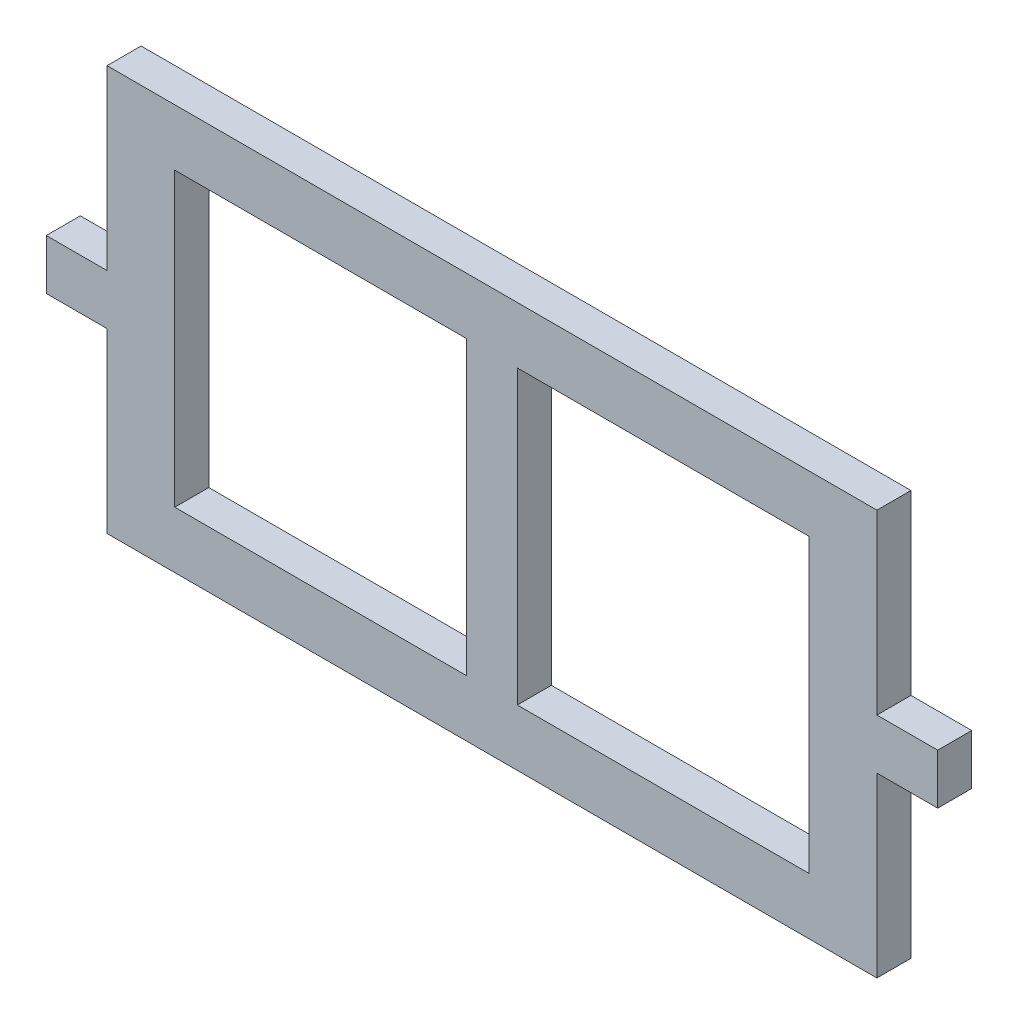
ISO-10303-21;
HEADER;
FILE_DESCRIPTION(('STEP AP214'),'2;1');
FILE_NAME('part.step','',(''),(''),'','','');
FILE_SCHEMA(('AUTOMOTIVE_DESIGN { 1 0 10303 214 1 1 1 1 }'));
ENDSEC;
DATA;
#1=APPLICATION_CONTEXT('core data for automotive mechanical design processes');
#2=APPLICATION_PROTOCOL_DEFINITION('international standard','automotive_design',2000,#1);
#3=PRODUCT_CONTEXT('',#1,'mechanical');
#4=PRODUCT('Part','Part','',(#3));
#5=PRODUCT_RELATED_PRODUCT_CATEGORY('part','',(#4));
#6=PRODUCT_DEFINITION_FORMATION('','',#4);
#7=PRODUCT_DEFINITION_CONTEXT('part definition',#1,'design');
#8=PRODUCT_DEFINITION('design','',#6,#7);
#9=PRODUCT_DEFINITION_SHAPE('','',#8);
#10=(LENGTH_UNIT() NAMED_UNIT(*) SI_UNIT(.MILLI.,.METRE.));
#11=(NAMED_UNIT(*) PLANE_ANGLE_UNIT() SI_UNIT($,.RADIAN.));
#12=(NAMED_UNIT(*) SI_UNIT($,.STERADIAN.) SOLID_ANGLE_UNIT());
#13=UNCERTAINTY_MEASURE_WITH_UNIT(LENGTH_MEASURE(1.E-05),#10,'distance_accuracy_value','');
#14=(GEOMETRIC_REPRESENTATION_CONTEXT(3) GLOBAL_UNCERTAINTY_ASSIGNED_CONTEXT((#13)) GLOBAL_UNIT_ASSIGNED_CONTEXT((#10,
#11,#12)) REPRESENTATION_CONTEXT('',''));
#15=CARTESIAN_POINT('',(0.,0.,0.));
#16=DIRECTION('',(0.,0.,1.));
#17=DIRECTION('',(1.,0.,0.));
#18=AXIS2_PLACEMENT_3D('',#15,#16,#17);
#19=CARTESIAN_POINT('',(120.65,-63.5,10.668));
#20=DIRECTION('',(-1.,0.,0.));
#21=DIRECTION('',(0.,0.,1.));
#22=AXIS2_PLACEMENT_3D('',#19,#20,#21);
#23=PLANE('',#22);
#24=DIRECTION('',(0.,0.,1.));
#25=VECTOR('',#24,1.);
#26=CARTESIAN_POINT('',(120.65,7.87399999999999,0.));
#27=LINE('',#26,#25);
#28=CARTESIAN_POINT('',(120.65,7.87399999999999,0.));
#29=VERTEX_POINT('',#28);
#30=CARTESIAN_POINT('',(120.65,7.87399999999999,10.668));
#31=VERTEX_POINT('',#30);
#32=EDGE_CURVE('E247',#29,#31,#27,.T.);
#33=ORIENTED_EDGE('',*,*,#32,.F.);
#34=DIRECTION('',(0.,1.,0.));
#35=VECTOR('',#34,1.);
#36=CARTESIAN_POINT('',(120.65,-63.5,0.));
#37=LINE('',#36,#35);
#38=CARTESIAN_POINT('',(120.65,63.5,0.));
#39=VERTEX_POINT('',#38);
#40=EDGE_CURVE('E198',#29,#39,#37,.T.);
#41=ORIENTED_EDGE('',*,*,#40,.T.);
#42=DIRECTION('',(0.,0.,-1.));
#43=VECTOR('',#42,1.);
#44=CARTESIAN_POINT('',(120.65,63.5,10.668));
#45=LINE('',#44,#43);
#46=CARTESIAN_POINT('',(120.65,63.5,10.668));
#47=VERTEX_POINT('',#46);
#48=EDGE_CURVE('E11',#47,#39,#45,.T.);
#49=ORIENTED_EDGE('',*,*,#48,.F.);
#50=DIRECTION('',(0.,1.,0.));
#51=VECTOR('',#50,1.);
#52=CARTESIAN_POINT('',(120.65,-63.5,10.668));
#53=LINE('',#52,#51);
#54=EDGE_CURVE('E212',#31,#47,#53,.T.);
#55=ORIENTED_EDGE('',*,*,#54,.F.);
#56=EDGE_LOOP('',(#33,#41,#49,#55));
#57=FACE_BOUND('',#56,.T.);
#58=ADVANCED_FACE('F36',(#57),#23,.F.);
#59=CARTESIAN_POINT('',(-120.65,-63.5,10.668));
#60=DIRECTION('',(1.,0.,0.));
#61=DIRECTION('',(0.,0.,-1.));
#62=AXIS2_PLACEMENT_3D('',#59,#60,#61);
#63=PLANE('',#62);
#64=DIRECTION('',(0.,0.,1.));
#65=VECTOR('',#64,1.);
#66=CARTESIAN_POINT('',(-120.65,-7.87400000000002,0.));
#67=LINE('',#66,#65);
#68=CARTESIAN_POINT('',(-120.65,-7.87400000000002,0.));
#69=VERTEX_POINT('',#68);
#70=CARTESIAN_POINT('',(-120.65,-7.87400000000002,10.668));
#71=VERTEX_POINT('',#70);
#72=EDGE_CURVE('E250',#69,#71,#67,.T.);
#73=ORIENTED_EDGE('',*,*,#72,.F.);
#74=DIRECTION('',(0.,-1.,0.));
#75=VECTOR('',#74,1.);
#76=CARTESIAN_POINT('',(-120.65,-63.5,0.));
#77=LINE('',#76,#75);
#78=CARTESIAN_POINT('',(-120.65,-63.5,0.));
#79=VERTEX_POINT('',#78);
#80=EDGE_CURVE('E200',#69,#79,#77,.T.);
#81=ORIENTED_EDGE('',*,*,#80,.T.);
#82=DIRECTION('',(0.,0.,-1.));
#83=VECTOR('',#82,1.);
#84=CARTESIAN_POINT('',(-120.65,-63.5,10.668));
#85=LINE('',#84,#83);
#86=CARTESIAN_POINT('',(-120.65,-63.5,10.668));
#87=VERTEX_POINT('',#86);
#88=EDGE_CURVE('E214',#87,#79,#85,.T.);
#89=ORIENTED_EDGE('',*,*,#88,.F.);
#90=DIRECTION('',(0.,-1.,0.));
#91=VECTOR('',#90,1.);
#92=CARTESIAN_POINT('',(-120.65,-63.5,10.668));
#93=LINE('',#92,#91);
#94=EDGE_CURVE('E321',#71,#87,#93,.T.);
#95=ORIENTED_EDGE('',*,*,#94,.F.);
#96=EDGE_LOOP('',(#73,#81,#89,#95));
#97=FACE_BOUND('',#96,.T.);
#98=ADVANCED_FACE('F331',(#97),#63,.F.);
#99=CARTESIAN_POINT('',(0.,0.,10.668));
#100=DIRECTION('',(0.,0.,-1.));
#101=DIRECTION('',(-1.,0.,0.));
#102=AXIS2_PLACEMENT_3D('',#99,#100,#101);
#103=PLANE('',#102);
#104=DIRECTION('',(0.,-1.,0.));
#105=VECTOR('',#104,1.);
#106=CARTESIAN_POINT('',(99.4375,0.,10.668));
#107=LINE('',#106,#105);
#108=CARTESIAN_POINT('',(99.4375,45.75,10.668));
#109=VERTEX_POINT('',#108);
#110=CARTESIAN_POINT('',(99.4375,-45.75,10.668));
#111=VERTEX_POINT('',#110);
#112=EDGE_CURVE('E252',#109,#111,#107,.T.);
#113=ORIENTED_EDGE('',*,*,#112,.T.);
#114=DIRECTION('',(1.,0.,0.));
#115=VECTOR('',#114,1.);
#116=CARTESIAN_POINT('',(0.,-45.75,10.668));
#117=LINE('',#116,#115);
#118=CARTESIAN_POINT('',(7.93750000000001,-45.75,10.668));
#119=VERTEX_POINT('',#118);
#120=EDGE_CURVE('E292',#119,#111,#117,.T.);
#121=ORIENTED_EDGE('',*,*,#120,.F.);
#122=DIRECTION('',(0.,-1.,0.));
#123=VECTOR('',#122,1.);
#124=CARTESIAN_POINT('',(7.93750000000001,0.,10.668));
#125=LINE('',#124,#123);
#126=CARTESIAN_POINT('',(7.9375,45.75,10.668));
#127=VERTEX_POINT('',#126);
#128=EDGE_CURVE('E306',#127,#119,#125,.T.);
#129=ORIENTED_EDGE('',*,*,#128,.F.);
#130=DIRECTION('',(1.,0.,0.));
#131=VECTOR('',#130,1.);
#132=CARTESIAN_POINT('',(0.,45.75,10.668));
#133=LINE('',#132,#131);
#134=EDGE_CURVE('E303',#127,#109,#133,.T.);
#135=ORIENTED_EDGE('',*,*,#134,.T.);
#136=EDGE_LOOP('',(#113,#121,#129,#135));
#137=FACE_BOUND('',#136,.T.);
#138=CARTESIAN_POINT('',(120.65,-63.5,10.668));
#139=VERTEX_POINT('',#138);
#140=CARTESIAN_POINT('',(120.65,-7.87400000000002,10.668));
#141=VERTEX_POINT('',#140);
#142=EDGE_CURVE('E318',#139,#141,#53,.T.);
#143=ORIENTED_EDGE('',*,*,#142,.T.);
#144=DIRECTION('',(-1.,0.,0.));
#145=VECTOR('',#144,1.);
#146=CARTESIAN_POINT('',(139.7,-7.87400000000001,10.668));
#147=LINE('',#146,#145);
#148=CARTESIAN_POINT('',(139.7,-7.87400000000001,10.668));
#149=VERTEX_POINT('',#148);
#150=EDGE_CURVE('E51',#149,#141,#147,.T.);
#151=ORIENTED_EDGE('',*,*,#150,.F.);
#152=DIRECTION('',(0.,-1.,0.));
#153=VECTOR('',#152,1.);
#154=CARTESIAN_POINT('',(139.7,7.87399999999999,10.668));
#155=LINE('',#154,#153);
#156=CARTESIAN_POINT('',(139.7,7.87399999999999,10.668));
#157=VERTEX_POINT('',#156);
#158=EDGE_CURVE('E336',#157,#149,#155,.T.);
#159=ORIENTED_EDGE('',*,*,#158,.F.);
#160=DIRECTION('',(1.,0.,0.));
#161=VECTOR('',#160,1.);
#162=CARTESIAN_POINT('',(120.65,7.87399999999999,10.668));
#163=LINE('',#162,#161);
#164=EDGE_CURVE('E184',#31,#157,#163,.T.);
#165=ORIENTED_EDGE('',*,*,#164,.F.);
#166=ORIENTED_EDGE('',*,*,#54,.T.);
#167=DIRECTION('',(-1.,0.,0.));
#168=VECTOR('',#167,1.);
#169=CARTESIAN_POINT('',(-120.65,63.5,10.668));
#170=LINE('',#169,#168);
#171=CARTESIAN_POINT('',(-120.65,63.5,10.668));
#172=VERTEX_POINT('',#171);
#173=EDGE_CURVE('E320',#47,#172,#170,.T.);
#174=ORIENTED_EDGE('',*,*,#173,.T.);
#175=CARTESIAN_POINT('',(-120.65,7.87399999999999,10.668));
#176=VERTEX_POINT('',#175);
#177=EDGE_CURVE('E223',#172,#176,#93,.T.);
#178=ORIENTED_EDGE('',*,*,#177,.T.);
#179=DIRECTION('',(-1.,0.,0.));
#180=VECTOR('',#179,1.);
#181=CARTESIAN_POINT('',(-120.65,7.87399999999999,10.668));
#182=LINE('',#181,#180);
#183=CARTESIAN_POINT('',(-139.7,7.87399999999999,10.668));
#184=VERTEX_POINT('',#183);
#185=EDGE_CURVE('E59',#176,#184,#182,.T.);
#186=ORIENTED_EDGE('',*,*,#185,.T.);
#187=DIRECTION('',(0.,-1.,0.));
#188=VECTOR('',#187,1.);
#189=CARTESIAN_POINT('',(-139.7,7.87399999999999,10.668));
#190=LINE('',#189,#188);
#191=CARTESIAN_POINT('',(-139.7,-7.87400000000001,10.668));
#192=VERTEX_POINT('',#191);
#193=EDGE_CURVE('E240',#184,#192,#190,.T.);
#194=ORIENTED_EDGE('',*,*,#193,.T.);
#195=DIRECTION('',(1.,0.,0.));
#196=VECTOR('',#195,1.);
#197=CARTESIAN_POINT('',(-139.7,-7.87400000000001,10.668));
#198=LINE('',#197,#196);
#199=EDGE_CURVE('E235',#192,#71,#198,.T.);
#200=ORIENTED_EDGE('',*,*,#199,.T.);
#201=ORIENTED_EDGE('',*,*,#94,.T.);
#202=DIRECTION('',(1.,0.,0.));
#203=VECTOR('',#202,1.);
#204=CARTESIAN_POINT('',(-120.65,-63.5,10.668));
#205=LINE('',#204,#203);
#206=EDGE_CURVE('E204',#87,#139,#205,.T.);
#207=ORIENTED_EDGE('',*,*,#206,.T.);
#208=EDGE_LOOP('',(#143,#151,#159,#165,#166,#174,#178,#186,#194,#200,#201,#207));
#209=FACE_BOUND('',#208,.T.);
#210=DIRECTION('',(0.,-1.,0.));
#211=VECTOR('',#210,1.);
#212=CARTESIAN_POINT('',(-7.93750000000001,0.,10.668));
#213=LINE('',#212,#211);
#214=CARTESIAN_POINT('',(-7.9375,45.75,10.668));
#215=VERTEX_POINT('',#214);
#216=CARTESIAN_POINT('',(-7.93750000000001,-45.75,10.668));
#217=VERTEX_POINT('',#216);
#218=EDGE_CURVE('E270',#215,#217,#213,.T.);
#219=ORIENTED_EDGE('',*,*,#218,.T.);
#220=DIRECTION('',(1.,0.,0.));
#221=VECTOR('',#220,1.);
#222=CARTESIAN_POINT('',(0.,-45.75,10.668));
#223=LINE('',#222,#221);
#224=CARTESIAN_POINT('',(-99.4375,-45.75,10.668));
#225=VERTEX_POINT('',#224);
#226=EDGE_CURVE('E261',#225,#217,#223,.T.);
#227=ORIENTED_EDGE('',*,*,#226,.F.);
#228=DIRECTION('',(0.,-1.,0.));
#229=VECTOR('',#228,1.);
#230=CARTESIAN_POINT('',(-99.4375,0.,10.668));
#231=LINE('',#230,#229);
#232=CARTESIAN_POINT('',(-99.4375,45.75,10.668));
#233=VERTEX_POINT('',#232);
#234=EDGE_CURVE('E277',#233,#225,#231,.T.);
#235=ORIENTED_EDGE('',*,*,#234,.F.);
#236=DIRECTION('',(1.,0.,0.));
#237=VECTOR('',#236,1.);
#238=CARTESIAN_POINT('',(0.,45.75,10.668));
#239=LINE('',#238,#237);
#240=EDGE_CURVE('E273',#233,#215,#239,.T.);
#241=ORIENTED_EDGE('',*,*,#240,.T.);
#242=EDGE_LOOP('',(#219,#227,#235,#241));
#243=FACE_BOUND('',#242,.T.);
#244=ADVANCED_FACE('F325',(#137,#209,#243),#103,.F.);
#245=CARTESIAN_POINT('',(0.,0.,0.));
#246=DIRECTION('',(0.,0.,-1.));
#247=DIRECTION('',(-1.,0.,0.));
#248=AXIS2_PLACEMENT_3D('',#245,#246,#247);
#249=PLANE('',#248);
#250=CARTESIAN_POINT('',(120.65,-63.5,0.));
#251=VERTEX_POINT('',#250);
#252=CARTESIAN_POINT('',(120.65,-7.87400000000002,0.));
#253=VERTEX_POINT('',#252);
#254=EDGE_CURVE('E180',#251,#253,#37,.T.);
#255=ORIENTED_EDGE('',*,*,#254,.F.);
#256=DIRECTION('',(1.,0.,0.));
#257=VECTOR('',#256,1.);
#258=CARTESIAN_POINT('',(-120.65,-63.5,0.));
#259=LINE('',#258,#257);
#260=EDGE_CURVE('E210',#79,#251,#259,.T.);
#261=ORIENTED_EDGE('',*,*,#260,.F.);
#262=ORIENTED_EDGE('',*,*,#80,.F.);
#263=DIRECTION('',(1.,0.,0.));
#264=VECTOR('',#263,1.);
#265=CARTESIAN_POINT('',(-139.7,-7.87400000000001,0.));
#266=LINE('',#265,#264);
#267=CARTESIAN_POINT('',(-139.7,-7.87400000000001,0.));
#268=VERTEX_POINT('',#267);
#269=EDGE_CURVE('E237',#268,#69,#266,.T.);
#270=ORIENTED_EDGE('',*,*,#269,.F.);
#271=DIRECTION('',(0.,-1.,0.));
#272=VECTOR('',#271,1.);
#273=CARTESIAN_POINT('',(-139.7,7.87399999999999,0.));
#274=LINE('',#273,#272);
#275=CARTESIAN_POINT('',(-139.7,7.87399999999999,0.));
#276=VERTEX_POINT('',#275);
#277=EDGE_CURVE('E234',#276,#268,#274,.T.);
#278=ORIENTED_EDGE('',*,*,#277,.F.);
#279=DIRECTION('',(-1.,0.,0.));
#280=VECTOR('',#279,1.);
#281=CARTESIAN_POINT('',(-120.65,7.87399999999999,0.));
#282=LINE('',#281,#280);
#283=CARTESIAN_POINT('',(-120.65,7.87399999999999,0.));
#284=VERTEX_POINT('',#283);
#285=EDGE_CURVE('E231',#284,#276,#282,.T.);
#286=ORIENTED_EDGE('',*,*,#285,.F.);
#287=CARTESIAN_POINT('',(-120.65,63.5,0.));
#288=VERTEX_POINT('',#287);
#289=EDGE_CURVE('E207',#288,#284,#77,.T.);
#290=ORIENTED_EDGE('',*,*,#289,.F.);
#291=DIRECTION('',(-1.,0.,0.));
#292=VECTOR('',#291,1.);
#293=CARTESIAN_POINT('',(-120.65,63.5,0.));
#294=LINE('',#293,#292);
#295=EDGE_CURVE('E197',#39,#288,#294,.T.);
#296=ORIENTED_EDGE('',*,*,#295,.F.);
#297=ORIENTED_EDGE('',*,*,#40,.F.);
#298=DIRECTION('',(1.,0.,0.));
#299=VECTOR('',#298,1.);
#300=CARTESIAN_POINT('',(120.65,7.87399999999999,0.));
#301=LINE('',#300,#299);
#302=CARTESIAN_POINT('',(139.7,7.87399999999999,0.));
#303=VERTEX_POINT('',#302);
#304=EDGE_CURVE('E192',#29,#303,#301,.T.);
#305=ORIENTED_EDGE('',*,*,#304,.T.);
#306=DIRECTION('',(0.,-1.,0.));
#307=VECTOR('',#306,1.);
#308=CARTESIAN_POINT('',(139.7,7.87399999999999,0.));
#309=LINE('',#308,#307);
#310=CARTESIAN_POINT('',(139.7,-7.87400000000001,0.));
#311=VERTEX_POINT('',#310);
#312=EDGE_CURVE('E182',#303,#311,#309,.T.);
#313=ORIENTED_EDGE('',*,*,#312,.T.);
#314=DIRECTION('',(-1.,0.,0.));
#315=VECTOR('',#314,1.);
#316=CARTESIAN_POINT('',(139.7,-7.87400000000001,0.));
#317=LINE('',#316,#315);
#318=EDGE_CURVE('E175',#311,#253,#317,.T.);
#319=ORIENTED_EDGE('',*,*,#318,.T.);
#320=EDGE_LOOP('',(#255,#261,#262,#270,#278,#286,#290,#296,#297,#305,#313,#319));
#321=FACE_BOUND('',#320,.T.);
#322=DIRECTION('',(1.,0.,0.));
#323=VECTOR('',#322,1.);
#324=CARTESIAN_POINT('',(0.,-45.75,0.));
#325=LINE('',#324,#323);
#326=CARTESIAN_POINT('',(7.93750000000001,-45.75,0.));
#327=VERTEX_POINT('',#326);
#328=CARTESIAN_POINT('',(99.4375,-45.75,0.));
#329=VERTEX_POINT('',#328);
#330=EDGE_CURVE('E297',#327,#329,#325,.T.);
#331=ORIENTED_EDGE('',*,*,#330,.T.);
#332=DIRECTION('',(0.,-1.,0.));
#333=VECTOR('',#332,1.);
#334=CARTESIAN_POINT('',(99.4375,0.,0.));
#335=LINE('',#334,#333);
#336=CARTESIAN_POINT('',(99.4375,45.75,0.));
#337=VERTEX_POINT('',#336);
#338=EDGE_CURVE('E289',#337,#329,#335,.T.);
#339=ORIENTED_EDGE('',*,*,#338,.F.);
#340=DIRECTION('',(1.,0.,0.));
#341=VECTOR('',#340,1.);
#342=CARTESIAN_POINT('',(0.,45.75,0.));
#343=LINE('',#342,#341);
#344=CARTESIAN_POINT('',(7.9375,45.75,0.));
#345=VERTEX_POINT('',#344);
#346=EDGE_CURVE('E291',#345,#337,#343,.T.);
#347=ORIENTED_EDGE('',*,*,#346,.F.);
#348=DIRECTION('',(0.,-1.,0.));
#349=VECTOR('',#348,1.);
#350=CARTESIAN_POINT('',(7.93750000000001,0.,0.));
#351=LINE('',#350,#349);
#352=EDGE_CURVE('E294',#345,#327,#351,.T.);
#353=ORIENTED_EDGE('',*,*,#352,.T.);
#354=EDGE_LOOP('',(#331,#339,#347,#353));
#355=FACE_BOUND('',#354,.T.);
#356=DIRECTION('',(1.,0.,0.));
#357=VECTOR('',#356,1.);
#358=CARTESIAN_POINT('',(0.,-45.75,0.));
#359=LINE('',#358,#357);
#360=CARTESIAN_POINT('',(-99.4375,-45.75,0.));
#361=VERTEX_POINT('',#360);
#362=CARTESIAN_POINT('',(-7.93750000000001,-45.75,0.));
#363=VERTEX_POINT('',#362);
#364=EDGE_CURVE('E266',#361,#363,#359,.T.);
#365=ORIENTED_EDGE('',*,*,#364,.T.);
#366=DIRECTION('',(0.,-1.,0.));
#367=VECTOR('',#366,1.);
#368=CARTESIAN_POINT('',(-7.93750000000001,0.,0.));
#369=LINE('',#368,#367);
#370=CARTESIAN_POINT('',(-7.9375,45.75,0.));
#371=VERTEX_POINT('',#370);
#372=EDGE_CURVE('E258',#371,#363,#369,.T.);
#373=ORIENTED_EDGE('',*,*,#372,.F.);
#374=DIRECTION('',(1.,0.,0.));
#375=VECTOR('',#374,1.);
#376=CARTESIAN_POINT('',(0.,45.75,0.));
#377=LINE('',#376,#375);
#378=CARTESIAN_POINT('',(-99.4375,45.75,0.));
#379=VERTEX_POINT('',#378);
#380=EDGE_CURVE('E260',#379,#371,#377,.T.);
#381=ORIENTED_EDGE('',*,*,#380,.F.);
#382=DIRECTION('',(0.,-1.,0.));
#383=VECTOR('',#382,1.);
#384=CARTESIAN_POINT('',(-99.4375,0.,0.));
#385=LINE('',#384,#383);
#386=EDGE_CURVE('E263',#379,#361,#385,.T.);
#387=ORIENTED_EDGE('',*,*,#386,.T.);
#388=EDGE_LOOP('',(#365,#373,#381,#387));
#389=FACE_BOUND('',#388,.T.);
#390=ADVANCED_FACE('F176',(#321,#355,#389),#249,.T.);
#391=ORIENTED_EDGE('',*,*,#254,.T.);
#392=DIRECTION('',(0.,0.,1.));
#393=VECTOR('',#392,1.);
#394=CARTESIAN_POINT('',(120.65,-7.87400000000002,0.));
#395=LINE('',#394,#393);
#396=EDGE_CURVE('E186',#253,#141,#395,.T.);
#397=ORIENTED_EDGE('',*,*,#396,.T.);
#398=ORIENTED_EDGE('',*,*,#142,.F.);
#399=DIRECTION('',(0.,0.,-1.));
#400=VECTOR('',#399,1.);
#401=CARTESIAN_POINT('',(120.65,-63.5,10.668));
#402=LINE('',#401,#400);
#403=EDGE_CURVE('E196',#139,#251,#402,.T.);
#404=ORIENTED_EDGE('',*,*,#403,.T.);
#405=EDGE_LOOP('',(#391,#397,#398,#404));
#406=FACE_BOUND('',#405,.T.);
#407=ADVANCED_FACE('F38',(#406),#23,.F.);
#408=CARTESIAN_POINT('',(-120.65,63.5,10.668));
#409=DIRECTION('',(0.,-1.,0.));
#410=DIRECTION('',(0.,0.,-1.));
#411=AXIS2_PLACEMENT_3D('',#408,#409,#410);
#412=PLANE('',#411);
#413=ORIENTED_EDGE('',*,*,#295,.T.);
#414=DIRECTION('',(0.,0.,-1.));
#415=VECTOR('',#414,1.);
#416=CARTESIAN_POINT('',(-120.65,63.5,10.668));
#417=LINE('',#416,#415);
#418=EDGE_CURVE('E44',#172,#288,#417,.T.);
#419=ORIENTED_EDGE('',*,*,#418,.F.);
#420=ORIENTED_EDGE('',*,*,#173,.F.);
#421=ORIENTED_EDGE('',*,*,#48,.T.);
#422=EDGE_LOOP('',(#413,#419,#420,#421));
#423=FACE_BOUND('',#422,.T.);
#424=ADVANCED_FACE('F356',(#423),#412,.F.);
#425=ORIENTED_EDGE('',*,*,#289,.T.);
#426=DIRECTION('',(0.,0.,1.));
#427=VECTOR('',#426,1.);
#428=CARTESIAN_POINT('',(-120.65,7.87399999999999,0.));
#429=LINE('',#428,#427);
#430=EDGE_CURVE('E245',#284,#176,#429,.T.);
#431=ORIENTED_EDGE('',*,*,#430,.T.);
#432=ORIENTED_EDGE('',*,*,#177,.F.);
#433=ORIENTED_EDGE('',*,*,#418,.T.);
#434=EDGE_LOOP('',(#425,#431,#432,#433));
#435=FACE_BOUND('',#434,.T.);
#436=ADVANCED_FACE('F221',(#435),#63,.F.);
#437=CARTESIAN_POINT('',(-120.65,-63.5,10.668));
#438=DIRECTION('',(0.,1.,0.));
#439=DIRECTION('',(0.,0.,1.));
#440=AXIS2_PLACEMENT_3D('',#437,#438,#439);
#441=PLANE('',#440);
#442=ORIENTED_EDGE('',*,*,#260,.T.);
#443=ORIENTED_EDGE('',*,*,#403,.F.);
#444=ORIENTED_EDGE('',*,*,#206,.F.);
#445=ORIENTED_EDGE('',*,*,#88,.T.);
#446=EDGE_LOOP('',(#442,#443,#444,#445));
#447=FACE_BOUND('',#446,.T.);
#448=ADVANCED_FACE('F334',(#447),#441,.F.);
#449=CARTESIAN_POINT('',(99.4375,0.,0.));
#450=DIRECTION('',(-1.,0.,0.));
#451=DIRECTION('',(0.,0.,1.));
#452=AXIS2_PLACEMENT_3D('',#449,#450,#451);
#453=PLANE('',#452);
#454=ORIENTED_EDGE('',*,*,#112,.F.);
#455=DIRECTION('',(0.,0.,1.));
#456=VECTOR('',#455,1.);
#457=CARTESIAN_POINT('',(99.4375,45.75,0.));
#458=LINE('',#457,#456);
#459=EDGE_CURVE('E300',#337,#109,#458,.T.);
#460=ORIENTED_EDGE('',*,*,#459,.F.);
#461=ORIENTED_EDGE('',*,*,#338,.T.);
#462=DIRECTION('',(0.,0.,1.));
#463=VECTOR('',#462,1.);
#464=CARTESIAN_POINT('',(99.4375,-45.75,0.));
#465=LINE('',#464,#463);
#466=EDGE_CURVE('E274',#329,#111,#465,.T.);
#467=ORIENTED_EDGE('',*,*,#466,.T.);
#468=EDGE_LOOP('',(#454,#460,#461,#467));
#469=FACE_BOUND('',#468,.T.);
#470=ADVANCED_FACE('F376',(#469),#453,.T.);
#471=CARTESIAN_POINT('',(0.,-45.75,0.));
#472=DIRECTION('',(0.,-1.,0.));
#473=DIRECTION('',(1.,0.,0.));
#474=AXIS2_PLACEMENT_3D('',#471,#472,#473);
#475=PLANE('',#474);
#476=ORIENTED_EDGE('',*,*,#120,.T.);
#477=ORIENTED_EDGE('',*,*,#466,.F.);
#478=ORIENTED_EDGE('',*,*,#330,.F.);
#479=DIRECTION('',(0.,0.,1.));
#480=VECTOR('',#479,1.);
#481=CARTESIAN_POINT('',(7.93750000000001,-45.75,0.));
#482=LINE('',#481,#480);
#483=EDGE_CURVE('E312',#327,#119,#482,.T.);
#484=ORIENTED_EDGE('',*,*,#483,.T.);
#485=EDGE_LOOP('',(#476,#477,#478,#484));
#486=FACE_BOUND('',#485,.T.);
#487=ADVANCED_FACE('F394',(#486),#475,.F.);
#488=CARTESIAN_POINT('',(7.93750000000001,0.,0.));
#489=DIRECTION('',(-1.,0.,0.));
#490=DIRECTION('',(0.,-1.,0.));
#491=AXIS2_PLACEMENT_3D('',#488,#489,#490);
#492=PLANE('',#491);
#493=ORIENTED_EDGE('',*,*,#128,.T.);
#494=ORIENTED_EDGE('',*,*,#483,.F.);
#495=ORIENTED_EDGE('',*,*,#352,.F.);
#496=DIRECTION('',(0.,0.,1.));
#497=VECTOR('',#496,1.);
#498=CARTESIAN_POINT('',(7.9375,45.75,0.));
#499=LINE('',#498,#497);
#500=EDGE_CURVE('E314',#345,#127,#499,.T.);
#501=ORIENTED_EDGE('',*,*,#500,.T.);
#502=EDGE_LOOP('',(#493,#494,#495,#501));
#503=FACE_BOUND('',#502,.T.);
#504=ADVANCED_FACE('F401',(#503),#492,.F.);
#505=CARTESIAN_POINT('',(0.,45.75,0.));
#506=DIRECTION('',(0.,-1.,0.));
#507=DIRECTION('',(0.,0.,-1.));
#508=AXIS2_PLACEMENT_3D('',#505,#506,#507);
#509=PLANE('',#508);
#510=ORIENTED_EDGE('',*,*,#134,.F.);
#511=ORIENTED_EDGE('',*,*,#500,.F.);
#512=ORIENTED_EDGE('',*,*,#346,.T.);
#513=ORIENTED_EDGE('',*,*,#459,.T.);
#514=EDGE_LOOP('',(#510,#511,#512,#513));
#515=FACE_BOUND('',#514,.T.);
#516=ADVANCED_FACE('F409',(#515),#509,.T.);
#517=CARTESIAN_POINT('',(-7.93750000000001,0.,0.));
#518=DIRECTION('',(-1.,0.,0.));
#519=DIRECTION('',(0.,-1.,0.));
#520=AXIS2_PLACEMENT_3D('',#517,#518,#519);
#521=PLANE('',#520);
#522=ORIENTED_EDGE('',*,*,#218,.F.);
#523=DIRECTION('',(0.,0.,1.));
#524=VECTOR('',#523,1.);
#525=CARTESIAN_POINT('',(-7.9375,45.75,0.));
#526=LINE('',#525,#524);
#527=EDGE_CURVE('E269',#371,#215,#526,.T.);
#528=ORIENTED_EDGE('',*,*,#527,.F.);
#529=ORIENTED_EDGE('',*,*,#372,.T.);
#530=DIRECTION('',(0.,0.,1.));
#531=VECTOR('',#530,1.);
#532=CARTESIAN_POINT('',(-7.93750000000001,-45.75,0.));
#533=LINE('',#532,#531);
#534=EDGE_CURVE('E202',#363,#217,#533,.T.);
#535=ORIENTED_EDGE('',*,*,#534,.T.);
#536=EDGE_LOOP('',(#522,#528,#529,#535));
#537=FACE_BOUND('',#536,.T.);
#538=ADVANCED_FACE('F417',(#537),#521,.T.);
#539=CARTESIAN_POINT('',(0.,-45.75,0.));
#540=DIRECTION('',(0.,-1.,0.));
#541=DIRECTION('',(1.,0.,0.));
#542=AXIS2_PLACEMENT_3D('',#539,#540,#541);
#543=PLANE('',#542);
#544=ORIENTED_EDGE('',*,*,#226,.T.);
#545=ORIENTED_EDGE('',*,*,#534,.F.);
#546=ORIENTED_EDGE('',*,*,#364,.F.);
#547=DIRECTION('',(0.,0.,1.));
#548=VECTOR('',#547,1.);
#549=CARTESIAN_POINT('',(-99.4375,-45.75,0.));
#550=LINE('',#549,#548);
#551=EDGE_CURVE('E283',#361,#225,#550,.T.);
#552=ORIENTED_EDGE('',*,*,#551,.T.);
#553=EDGE_LOOP('',(#544,#545,#546,#552));
#554=FACE_BOUND('',#553,.T.);
#555=ADVANCED_FACE('F425',(#554),#543,.F.);
#556=CARTESIAN_POINT('',(-99.4375,0.,0.));
#557=DIRECTION('',(-1.,0.,0.));
#558=DIRECTION('',(0.,0.,1.));
#559=AXIS2_PLACEMENT_3D('',#556,#557,#558);
#560=PLANE('',#559);
#561=ORIENTED_EDGE('',*,*,#234,.T.);
#562=ORIENTED_EDGE('',*,*,#551,.F.);
#563=ORIENTED_EDGE('',*,*,#386,.F.);
#564=DIRECTION('',(0.,0.,1.));
#565=VECTOR('',#564,1.);
#566=CARTESIAN_POINT('',(-99.4375,45.75,0.));
#567=LINE('',#566,#565);
#568=EDGE_CURVE('E285',#379,#233,#567,.T.);
#569=ORIENTED_EDGE('',*,*,#568,.T.);
#570=EDGE_LOOP('',(#561,#562,#563,#569));
#571=FACE_BOUND('',#570,.T.);
#572=ADVANCED_FACE('F433',(#571),#560,.F.);
#573=CARTESIAN_POINT('',(0.,45.75,0.));
#574=DIRECTION('',(0.,-1.,0.));
#575=DIRECTION('',(0.,0.,-1.));
#576=AXIS2_PLACEMENT_3D('',#573,#574,#575);
#577=PLANE('',#576);
#578=ORIENTED_EDGE('',*,*,#240,.F.);
#579=ORIENTED_EDGE('',*,*,#568,.F.);
#580=ORIENTED_EDGE('',*,*,#380,.T.);
#581=ORIENTED_EDGE('',*,*,#527,.T.);
#582=EDGE_LOOP('',(#578,#579,#580,#581));
#583=FACE_BOUND('',#582,.T.);
#584=ADVANCED_FACE('F441',(#583),#577,.T.);
#585=CARTESIAN_POINT('',(-139.7,-7.87400000000001,0.));
#586=DIRECTION('',(0.,-1.,0.));
#587=DIRECTION('',(1.,0.,0.));
#588=AXIS2_PLACEMENT_3D('',#585,#586,#587);
#589=PLANE('',#588);
#590=ORIENTED_EDGE('',*,*,#199,.F.);
#591=DIRECTION('',(0.,0.,1.));
#592=VECTOR('',#591,1.);
#593=CARTESIAN_POINT('',(-139.7,-7.87400000000001,0.));
#594=LINE('',#593,#592);
#595=EDGE_CURVE('E253',#268,#192,#594,.T.);
#596=ORIENTED_EDGE('',*,*,#595,.F.);
#597=ORIENTED_EDGE('',*,*,#269,.T.);
#598=ORIENTED_EDGE('',*,*,#72,.T.);
#599=EDGE_LOOP('',(#590,#596,#597,#598));
#600=FACE_BOUND('',#599,.T.);
#601=ADVANCED_FACE('F449',(#600),#589,.T.);
#602=CARTESIAN_POINT('',(-139.7,7.87399999999999,0.));
#603=DIRECTION('',(-1.,0.,0.));
#604=DIRECTION('',(0.,0.,1.));
#605=AXIS2_PLACEMENT_3D('',#602,#603,#604);
#606=PLANE('',#605);
#607=ORIENTED_EDGE('',*,*,#193,.F.);
#608=DIRECTION('',(0.,0.,1.));
#609=VECTOR('',#608,1.);
#610=CARTESIAN_POINT('',(-139.7,7.87399999999999,0.));
#611=LINE('',#610,#609);
#612=EDGE_CURVE('E255',#276,#184,#611,.T.);
#613=ORIENTED_EDGE('',*,*,#612,.F.);
#614=ORIENTED_EDGE('',*,*,#277,.T.);
#615=ORIENTED_EDGE('',*,*,#595,.T.);
#616=EDGE_LOOP('',(#607,#613,#614,#615));
#617=FACE_BOUND('',#616,.T.);
#618=ADVANCED_FACE('F456',(#617),#606,.T.);
#619=CARTESIAN_POINT('',(-120.65,7.87399999999999,0.));
#620=DIRECTION('',(0.,1.,0.));
#621=DIRECTION('',(0.,0.,1.));
#622=AXIS2_PLACEMENT_3D('',#619,#620,#621);
#623=PLANE('',#622);
#624=ORIENTED_EDGE('',*,*,#185,.F.);
#625=ORIENTED_EDGE('',*,*,#430,.F.);
#626=ORIENTED_EDGE('',*,*,#285,.T.);
#627=ORIENTED_EDGE('',*,*,#612,.T.);
#628=EDGE_LOOP('',(#624,#625,#626,#627));
#629=FACE_BOUND('',#628,.T.);
#630=ADVANCED_FACE('F464',(#629),#623,.T.);
#631=CARTESIAN_POINT('',(120.65,7.87399999999999,0.));
#632=DIRECTION('',(0.,-1.,0.));
#633=DIRECTION('',(0.,0.,-1.));
#634=AXIS2_PLACEMENT_3D('',#631,#632,#633);
#635=PLANE('',#634);
#636=ORIENTED_EDGE('',*,*,#164,.T.);
#637=DIRECTION('',(0.,0.,1.));
#638=VECTOR('',#637,1.);
#639=CARTESIAN_POINT('',(139.7,7.87399999999999,0.));
#640=LINE('',#639,#638);
#641=EDGE_CURVE('E345',#303,#157,#640,.T.);
#642=ORIENTED_EDGE('',*,*,#641,.F.);
#643=ORIENTED_EDGE('',*,*,#304,.F.);
#644=ORIENTED_EDGE('',*,*,#32,.T.);
#645=EDGE_LOOP('',(#636,#642,#643,#644));
#646=FACE_BOUND('',#645,.T.);
#647=ADVANCED_FACE('F351',(#646),#635,.F.);
#648=CARTESIAN_POINT('',(139.7,7.87399999999999,0.));
#649=DIRECTION('',(-1.,0.,0.));
#650=DIRECTION('',(0.,0.,1.));
#651=AXIS2_PLACEMENT_3D('',#648,#649,#650);
#652=PLANE('',#651);
#653=ORIENTED_EDGE('',*,*,#158,.T.);
#654=DIRECTION('',(0.,0.,1.));
#655=VECTOR('',#654,1.);
#656=CARTESIAN_POINT('',(139.7,-7.87400000000001,0.));
#657=LINE('',#656,#655);
#658=EDGE_CURVE('E191',#311,#149,#657,.T.);
#659=ORIENTED_EDGE('',*,*,#658,.F.);
#660=ORIENTED_EDGE('',*,*,#312,.F.);
#661=ORIENTED_EDGE('',*,*,#641,.T.);
#662=EDGE_LOOP('',(#653,#659,#660,#661));
#663=FACE_BOUND('',#662,.T.);
#664=ADVANCED_FACE('F348',(#663),#652,.F.);
#665=CARTESIAN_POINT('',(139.7,-7.87400000000001,0.));
#666=DIRECTION('',(0.,1.,0.));
#667=DIRECTION('',(-1.,0.,0.));
#668=AXIS2_PLACEMENT_3D('',#665,#666,#667);
#669=PLANE('',#668);
#670=ORIENTED_EDGE('',*,*,#150,.T.);
#671=ORIENTED_EDGE('',*,*,#396,.F.);
#672=ORIENTED_EDGE('',*,*,#318,.F.);
#673=ORIENTED_EDGE('',*,*,#658,.T.);
#674=EDGE_LOOP('',(#670,#671,#672,#673));
#675=FACE_BOUND('',#674,.T.);
#676=ADVANCED_FACE('F187',(#675),#669,.F.);
#677=CLOSED_SHELL('',(#58,#98,#244,#390,#407,#424,#436,#448,#470,#487,#504,#516,#538,#555,#572,
#584,#601,#618,#630,#647,#664,#676));
#678=MANIFOLD_SOLID_BREP('B2',#677);
#679=ADVANCED_BREP_SHAPE_REPRESENTATION('',(#18,#678),#14);
#680=SHAPE_DEFINITION_REPRESENTATION(#9,#679);
ENDSEC;
END-ISO-10303-21;
